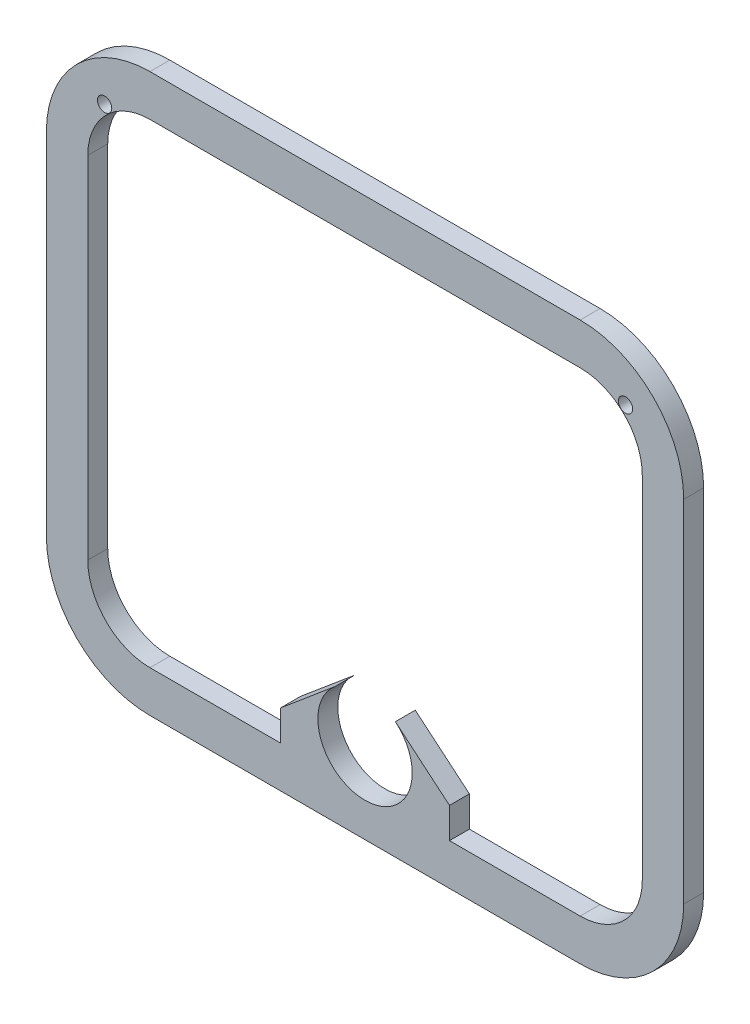
ISO-10303-21;
HEADER;
FILE_DESCRIPTION(('STEP AP214'),'2;1');
FILE_NAME('part.step','',(''),(''),'','','');
FILE_SCHEMA(('AUTOMOTIVE_DESIGN { 1 0 10303 214 1 1 1 1 }'));
ENDSEC;
DATA;
#1=APPLICATION_CONTEXT('core data for automotive mechanical design processes');
#2=APPLICATION_PROTOCOL_DEFINITION('international standard','automotive_design',2000,#1);
#3=PRODUCT_CONTEXT('',#1,'mechanical');
#4=PRODUCT('Part','Part','',(#3));
#5=PRODUCT_RELATED_PRODUCT_CATEGORY('part','',(#4));
#6=PRODUCT_DEFINITION_FORMATION('','',#4);
#7=PRODUCT_DEFINITION_CONTEXT('part definition',#1,'design');
#8=PRODUCT_DEFINITION('design','',#6,#7);
#9=PRODUCT_DEFINITION_SHAPE('','',#8);
#10=(LENGTH_UNIT() NAMED_UNIT(*) SI_UNIT(.MILLI.,.METRE.));
#11=(NAMED_UNIT(*) PLANE_ANGLE_UNIT() SI_UNIT($,.RADIAN.));
#12=(NAMED_UNIT(*) SI_UNIT($,.STERADIAN.) SOLID_ANGLE_UNIT());
#13=UNCERTAINTY_MEASURE_WITH_UNIT(LENGTH_MEASURE(1.E-05),#10,'distance_accuracy_value','');
#14=(GEOMETRIC_REPRESENTATION_CONTEXT(3) GLOBAL_UNCERTAINTY_ASSIGNED_CONTEXT((#13)) GLOBAL_UNIT_ASSIGNED_CONTEXT((#10,
#11,#12)) REPRESENTATION_CONTEXT('',''));
#15=CARTESIAN_POINT('',(0.,0.,0.));
#16=DIRECTION('',(0.,0.,1.));
#17=DIRECTION('',(1.,0.,0.));
#18=AXIS2_PLACEMENT_3D('',#15,#16,#17);
#19=CARTESIAN_POINT('',(-17.145,13.97,1.5875));
#20=DIRECTION('',(0.,0.,1.));
#21=DIRECTION('',(1.,0.,0.));
#22=AXIS2_PLACEMENT_3D('',#19,#20,#21);
#23=PLANE('',#22);
#24=DIRECTION('',(1.,0.,0.));
#25=VECTOR('',#24,1.);
#26=CARTESIAN_POINT('',(9.63209466642005,-18.923,1.5875));
#27=LINE('',#26,#25);
#28=CARTESIAN_POINT('',(6.73100000000013,-18.923,1.5875));
#29=VERTEX_POINT('',#28);
#30=CARTESIAN_POINT('',(17.145,-18.923,1.5875));
#31=VERTEX_POINT('',#30);
#32=EDGE_CURVE('E295',#29,#31,#27,.T.);
#33=ORIENTED_EDGE('',*,*,#32,.F.);
#34=DIRECTION('',(0.,-1.,0.));
#35=VECTOR('',#34,1.);
#36=CARTESIAN_POINT('',(6.73100000000013,-18.923,1.5875));
#37=LINE('',#36,#35);
#38=CARTESIAN_POINT('',(6.73100000000011,-16.4886925353965,1.5875));
#39=VERTEX_POINT('',#38);
#40=EDGE_CURVE('E317',#39,#29,#37,.T.);
#41=ORIENTED_EDGE('',*,*,#40,.F.);
#42=DIRECTION('',(0.766044443118977,-0.642787609686541,0.));
#43=VECTOR('',#42,1.);
#44=CARTESIAN_POINT('',(2.41636718233356,-12.8682857294272,1.5875));
#45=LINE('',#44,#43);
#46=CARTESIAN_POINT('',(2.41636718233356,-12.8682857294272,1.5875));
#47=VERTEX_POINT('',#46);
#48=EDGE_CURVE('E298',#47,#39,#45,.T.);
#49=ORIENTED_EDGE('',*,*,#48,.F.);
#50=CARTESIAN_POINT('',(0.,-15.748,1.5875));
#51=DIRECTION('',(0.,0.,1.));
#52=DIRECTION('',(1.,0.,0.));
#53=AXIS2_PLACEMENT_3D('',#50,#51,#52);
#54=CIRCLE('',#53,3.75919999999987);
#55=CARTESIAN_POINT('',(-2.41636718233356,-12.8682857294272,1.5875));
#56=VERTEX_POINT('',#55);
#57=EDGE_CURVE('E235',#56,#47,#54,.T.);
#58=ORIENTED_EDGE('',*,*,#57,.F.);
#59=DIRECTION('',(0.766044443118977,0.642787609686541,0.));
#60=VECTOR('',#59,1.);
#61=CARTESIAN_POINT('',(-2.41636718233356,-12.8682857294272,1.5875));
#62=LINE('',#61,#60);
#63=CARTESIAN_POINT('',(-6.731,-16.4886925353965,1.5875));
#64=VERTEX_POINT('',#63);
#65=EDGE_CURVE('E233',#64,#56,#62,.T.);
#66=ORIENTED_EDGE('',*,*,#65,.F.);
#67=DIRECTION('',(0.,1.,0.));
#68=VECTOR('',#67,1.);
#69=CARTESIAN_POINT('',(-6.731,-18.923,1.5875));
#70=LINE('',#69,#68);
#71=CARTESIAN_POINT('',(-6.731,-18.923,1.5875));
#72=VERTEX_POINT('',#71);
#73=EDGE_CURVE('E305',#72,#64,#70,.T.);
#74=ORIENTED_EDGE('',*,*,#73,.F.);
#75=DIRECTION('',(1.,0.,0.));
#76=VECTOR('',#75,1.);
#77=CARTESIAN_POINT('',(-17.145,-18.923,1.5875));
#78=LINE('',#77,#76);
#79=CARTESIAN_POINT('',(-17.145,-18.923,1.5875));
#80=VERTEX_POINT('',#79);
#81=EDGE_CURVE('E271',#80,#72,#78,.T.);
#82=ORIENTED_EDGE('',*,*,#81,.F.);
#83=CARTESIAN_POINT('',(-17.145,-13.97,1.5875));
#84=DIRECTION('',(0.,0.,1.));
#85=DIRECTION('',(-1.,0.,0.));
#86=AXIS2_PLACEMENT_3D('',#83,#84,#85);
#87=CIRCLE('',#86,4.953);
#88=CARTESIAN_POINT('',(-22.098,-13.97,1.5875));
#89=VERTEX_POINT('',#88);
#90=EDGE_CURVE('E274',#89,#80,#87,.T.);
#91=ORIENTED_EDGE('',*,*,#90,.F.);
#92=DIRECTION('',(0.,-1.,0.));
#93=VECTOR('',#92,1.);
#94=CARTESIAN_POINT('',(-22.098,13.97,1.5875));
#95=LINE('',#94,#93);
#96=CARTESIAN_POINT('',(-22.098,13.97,1.5875));
#97=VERTEX_POINT('',#96);
#98=EDGE_CURVE('E277',#97,#89,#95,.T.);
#99=ORIENTED_EDGE('',*,*,#98,.F.);
#100=CARTESIAN_POINT('',(-17.145,13.97,1.5875));
#101=DIRECTION('',(0.,0.,1.));
#102=DIRECTION('',(1.,0.,0.));
#103=AXIS2_PLACEMENT_3D('',#100,#101,#102);
#104=CIRCLE('',#103,4.953);
#105=CARTESIAN_POINT('',(-17.145,18.923,1.5875));
#106=VERTEX_POINT('',#105);
#107=EDGE_CURVE('E280',#106,#97,#104,.T.);
#108=ORIENTED_EDGE('',*,*,#107,.F.);
#109=DIRECTION('',(-1.,0.,0.));
#110=VECTOR('',#109,1.);
#111=CARTESIAN_POINT('',(17.145,18.923,1.5875));
#112=LINE('',#111,#110);
#113=CARTESIAN_POINT('',(17.145,18.923,1.5875));
#114=VERTEX_POINT('',#113);
#115=EDGE_CURVE('E283',#114,#106,#112,.T.);
#116=ORIENTED_EDGE('',*,*,#115,.F.);
#117=CARTESIAN_POINT('',(17.145,13.97,1.5875));
#118=DIRECTION('',(0.,0.,1.));
#119=DIRECTION('',(-1.,0.,0.));
#120=AXIS2_PLACEMENT_3D('',#117,#118,#119);
#121=CIRCLE('',#120,4.953);
#122=CARTESIAN_POINT('',(22.098,13.97,1.5875));
#123=VERTEX_POINT('',#122);
#124=EDGE_CURVE('E286',#123,#114,#121,.T.);
#125=ORIENTED_EDGE('',*,*,#124,.F.);
#126=DIRECTION('',(0.,1.,0.));
#127=VECTOR('',#126,1.);
#128=CARTESIAN_POINT('',(22.098,13.97,1.5875));
#129=LINE('',#128,#127);
#130=CARTESIAN_POINT('',(22.098,-13.97,1.5875));
#131=VERTEX_POINT('',#130);
#132=EDGE_CURVE('E289',#131,#123,#129,.T.);
#133=ORIENTED_EDGE('',*,*,#132,.F.);
#134=CARTESIAN_POINT('',(17.145,-13.97,1.5875));
#135=DIRECTION('',(0.,0.,1.));
#136=DIRECTION('',(-1.,0.,0.));
#137=AXIS2_PLACEMENT_3D('',#134,#135,#136);
#138=CIRCLE('',#137,4.953);
#139=EDGE_CURVE('E292',#31,#131,#138,.T.);
#140=ORIENTED_EDGE('',*,*,#139,.F.);
#141=EDGE_LOOP('',(#33,#41,#49,#58,#66,#74,#82,#91,#99,#108,#116,#125,#133,#140));
#142=FACE_BOUND('',#141,.T.);
#143=CARTESIAN_POINT('',(20.7596111227927,18.1646597324437,1.5875));
#144=DIRECTION('',(0.,0.,1.));
#145=DIRECTION('',(-1.,0.,0.));
#146=AXIS2_PLACEMENT_3D('',#143,#144,#145);
#147=CIRCLE('',#146,0.571499999999998);
#148=CARTESIAN_POINT('',(20.1881111227927,18.1646597324437,1.5875));
#149=VERTEX_POINT('',#148);
#150=EDGE_CURVE('E195',#149,#149,#147,.T.);
#151=ORIENTED_EDGE('',*,*,#150,.F.);
#152=EDGE_LOOP('',(#151));
#153=FACE_BOUND('',#152,.T.);
#154=CARTESIAN_POINT('',(-17.145,13.97,1.5875));
#155=DIRECTION('',(0.,0.,1.));
#156=DIRECTION('',(1.,0.,0.));
#157=AXIS2_PLACEMENT_3D('',#154,#155,#156);
#158=CIRCLE('',#157,8.255);
#159=CARTESIAN_POINT('',(-17.145,22.225,1.5875));
#160=VERTEX_POINT('',#159);
#161=CARTESIAN_POINT('',(-25.4,13.97,1.5875));
#162=VERTEX_POINT('',#161);
#163=EDGE_CURVE('E158',#160,#162,#158,.T.);
#164=ORIENTED_EDGE('',*,*,#163,.T.);
#165=DIRECTION('',(0.,-1.,0.));
#166=VECTOR('',#165,1.);
#167=CARTESIAN_POINT('',(-25.4,13.97,1.5875));
#168=LINE('',#167,#166);
#169=CARTESIAN_POINT('',(-25.4,-13.97,1.5875));
#170=VERTEX_POINT('',#169);
#171=EDGE_CURVE('E98',#162,#170,#168,.T.);
#172=ORIENTED_EDGE('',*,*,#171,.T.);
#173=CARTESIAN_POINT('',(-17.145,-13.97,1.5875));
#174=DIRECTION('',(0.,0.,1.));
#175=DIRECTION('',(-1.,0.,0.));
#176=AXIS2_PLACEMENT_3D('',#173,#174,#175);
#177=CIRCLE('',#176,8.255);
#178=CARTESIAN_POINT('',(-17.145,-22.225,1.5875));
#179=VERTEX_POINT('',#178);
#180=EDGE_CURVE('E173',#170,#179,#177,.T.);
#181=ORIENTED_EDGE('',*,*,#180,.T.);
#182=DIRECTION('',(1.,0.,0.));
#183=VECTOR('',#182,1.);
#184=CARTESIAN_POINT('',(17.145,-22.225,1.5875));
#185=LINE('',#184,#183);
#186=CARTESIAN_POINT('',(17.145,-22.225,1.5875));
#187=VERTEX_POINT('',#186);
#188=EDGE_CURVE('E186',#179,#187,#185,.T.);
#189=ORIENTED_EDGE('',*,*,#188,.T.);
#190=CARTESIAN_POINT('',(17.145,-13.97,1.5875));
#191=DIRECTION('',(0.,0.,1.));
#192=DIRECTION('',(-1.,0.,0.));
#193=AXIS2_PLACEMENT_3D('',#190,#191,#192);
#194=CIRCLE('',#193,8.255);
#195=CARTESIAN_POINT('',(25.4,-13.97,1.5875));
#196=VERTEX_POINT('',#195);
#197=EDGE_CURVE('E121',#187,#196,#194,.T.);
#198=ORIENTED_EDGE('',*,*,#197,.T.);
#199=DIRECTION('',(0.,1.,0.));
#200=VECTOR('',#199,1.);
#201=CARTESIAN_POINT('',(25.4,13.97,1.5875));
#202=LINE('',#201,#200);
#203=CARTESIAN_POINT('',(25.4,13.97,1.5875));
#204=VERTEX_POINT('',#203);
#205=EDGE_CURVE('E114',#196,#204,#202,.T.);
#206=ORIENTED_EDGE('',*,*,#205,.T.);
#207=CARTESIAN_POINT('',(17.145,13.97,1.5875));
#208=DIRECTION('',(0.,0.,1.));
#209=DIRECTION('',(-1.,0.,0.));
#210=AXIS2_PLACEMENT_3D('',#207,#208,#209);
#211=CIRCLE('',#210,8.255);
#212=CARTESIAN_POINT('',(17.145,22.225,1.5875));
#213=VERTEX_POINT('',#212);
#214=EDGE_CURVE('E118',#204,#213,#211,.T.);
#215=ORIENTED_EDGE('',*,*,#214,.T.);
#216=DIRECTION('',(-1.,0.,0.));
#217=VECTOR('',#216,1.);
#218=CARTESIAN_POINT('',(17.145,22.225,1.5875));
#219=LINE('',#218,#217);
#220=EDGE_CURVE('E57',#213,#160,#219,.T.);
#221=ORIENTED_EDGE('',*,*,#220,.T.);
#222=EDGE_LOOP('',(#164,#172,#181,#189,#198,#206,#215,#221));
#223=FACE_BOUND('',#222,.T.);
#224=CARTESIAN_POINT('',(-20.7596111227927,18.1646597324436,1.5875));
#225=DIRECTION('',(0.,0.,1.));
#226=DIRECTION('',(1.,0.,0.));
#227=AXIS2_PLACEMENT_3D('',#224,#225,#226);
#228=CIRCLE('',#227,0.571499999999999);
#229=CARTESIAN_POINT('',(-20.1881111227927,18.1646597324436,1.5875));
#230=VERTEX_POINT('',#229);
#231=EDGE_CURVE('E146',#230,#230,#228,.T.);
#232=ORIENTED_EDGE('',*,*,#231,.F.);
#233=EDGE_LOOP('',(#232));
#234=FACE_BOUND('',#233,.T.);
#235=ADVANCED_FACE('F33',(#142,#153,#223,#234),#23,.T.);
#236=CARTESIAN_POINT('',(-17.145,13.97,0.));
#237=DIRECTION('',(0.,0.,1.));
#238=DIRECTION('',(1.,0.,0.));
#239=AXIS2_PLACEMENT_3D('',#236,#237,#238);
#240=PLANE('',#239);
#241=CARTESIAN_POINT('',(20.7596111227927,18.1646597324437,0.));
#242=DIRECTION('',(0.,0.,1.));
#243=DIRECTION('',(-1.,0.,0.));
#244=AXIS2_PLACEMENT_3D('',#241,#242,#243);
#245=CIRCLE('',#244,0.571499999999998);
#246=CARTESIAN_POINT('',(20.1881111227927,18.1646597324437,0.));
#247=VERTEX_POINT('',#246);
#248=EDGE_CURVE('E198',#247,#247,#245,.T.);
#249=ORIENTED_EDGE('',*,*,#248,.T.);
#250=EDGE_LOOP('',(#249));
#251=FACE_BOUND('',#250,.T.);
#252=CARTESIAN_POINT('',(-17.145,13.97,0.));
#253=DIRECTION('',(0.,0.,1.));
#254=DIRECTION('',(1.,0.,0.));
#255=AXIS2_PLACEMENT_3D('',#252,#253,#254);
#256=CIRCLE('',#255,8.255);
#257=CARTESIAN_POINT('',(-17.145,22.225,0.));
#258=VERTEX_POINT('',#257);
#259=CARTESIAN_POINT('',(-25.4,13.97,0.));
#260=VERTEX_POINT('',#259);
#261=EDGE_CURVE('E142',#258,#260,#256,.T.);
#262=ORIENTED_EDGE('',*,*,#261,.F.);
#263=DIRECTION('',(-1.,0.,0.));
#264=VECTOR('',#263,1.);
#265=CARTESIAN_POINT('',(17.145,22.225,0.));
#266=LINE('',#265,#264);
#267=CARTESIAN_POINT('',(17.145,22.225,0.));
#268=VERTEX_POINT('',#267);
#269=EDGE_CURVE('E90',#268,#258,#266,.T.);
#270=ORIENTED_EDGE('',*,*,#269,.F.);
#271=CARTESIAN_POINT('',(17.145,13.97,0.));
#272=DIRECTION('',(0.,0.,1.));
#273=DIRECTION('',(-1.,0.,0.));
#274=AXIS2_PLACEMENT_3D('',#271,#272,#273);
#275=CIRCLE('',#274,8.255);
#276=CARTESIAN_POINT('',(25.4,13.97,0.));
#277=VERTEX_POINT('',#276);
#278=EDGE_CURVE('E155',#277,#268,#275,.T.);
#279=ORIENTED_EDGE('',*,*,#278,.F.);
#280=DIRECTION('',(0.,1.,0.));
#281=VECTOR('',#280,1.);
#282=CARTESIAN_POINT('',(25.4,13.97,0.));
#283=LINE('',#282,#281);
#284=CARTESIAN_POINT('',(25.4,-13.97,0.));
#285=VERTEX_POINT('',#284);
#286=EDGE_CURVE('E130',#285,#277,#283,.T.);
#287=ORIENTED_EDGE('',*,*,#286,.F.);
#288=CARTESIAN_POINT('',(17.145,-13.97,0.));
#289=DIRECTION('',(0.,0.,1.));
#290=DIRECTION('',(-1.,0.,0.));
#291=AXIS2_PLACEMENT_3D('',#288,#289,#290);
#292=CIRCLE('',#291,8.255);
#293=CARTESIAN_POINT('',(17.145,-22.225,0.));
#294=VERTEX_POINT('',#293);
#295=EDGE_CURVE('E152',#294,#285,#292,.T.);
#296=ORIENTED_EDGE('',*,*,#295,.F.);
#297=DIRECTION('',(1.,0.,0.));
#298=VECTOR('',#297,1.);
#299=CARTESIAN_POINT('',(17.145,-22.225,0.));
#300=LINE('',#299,#298);
#301=CARTESIAN_POINT('',(-17.145,-22.225,0.));
#302=VERTEX_POINT('',#301);
#303=EDGE_CURVE('E150',#302,#294,#300,.T.);
#304=ORIENTED_EDGE('',*,*,#303,.F.);
#305=CARTESIAN_POINT('',(-17.145,-13.97,0.));
#306=DIRECTION('',(0.,0.,1.));
#307=DIRECTION('',(-1.,0.,0.));
#308=AXIS2_PLACEMENT_3D('',#305,#306,#307);
#309=CIRCLE('',#308,8.255);
#310=CARTESIAN_POINT('',(-25.4,-13.97,0.));
#311=VERTEX_POINT('',#310);
#312=EDGE_CURVE('E148',#311,#302,#309,.T.);
#313=ORIENTED_EDGE('',*,*,#312,.F.);
#314=DIRECTION('',(0.,-1.,0.));
#315=VECTOR('',#314,1.);
#316=CARTESIAN_POINT('',(-25.4,13.97,0.));
#317=LINE('',#316,#315);
#318=EDGE_CURVE('E145',#260,#311,#317,.T.);
#319=ORIENTED_EDGE('',*,*,#318,.F.);
#320=EDGE_LOOP('',(#262,#270,#279,#287,#296,#304,#313,#319));
#321=FACE_BOUND('',#320,.T.);
#322=CARTESIAN_POINT('',(-20.7596111227927,18.1646597324436,0.));
#323=DIRECTION('',(0.,0.,1.));
#324=DIRECTION('',(1.,0.,0.));
#325=AXIS2_PLACEMENT_3D('',#322,#323,#324);
#326=CIRCLE('',#325,0.571499999999999);
#327=CARTESIAN_POINT('',(-20.1881111227927,18.1646597324436,0.));
#328=VERTEX_POINT('',#327);
#329=EDGE_CURVE('E192',#328,#328,#326,.T.);
#330=ORIENTED_EDGE('',*,*,#329,.T.);
#331=EDGE_LOOP('',(#330));
#332=FACE_BOUND('',#331,.T.);
#333=DIRECTION('',(0.,1.,0.));
#334=VECTOR('',#333,1.);
#335=CARTESIAN_POINT('',(6.73100000000013,-18.923,0.));
#336=LINE('',#335,#334);
#337=CARTESIAN_POINT('',(6.73100000000013,-18.923,0.));
#338=VERTEX_POINT('',#337);
#339=CARTESIAN_POINT('',(6.73100000000011,-16.4886925353965,0.));
#340=VERTEX_POINT('',#339);
#341=EDGE_CURVE('E320',#338,#340,#336,.T.);
#342=ORIENTED_EDGE('',*,*,#341,.F.);
#343=DIRECTION('',(1.,0.,0.));
#344=VECTOR('',#343,1.);
#345=CARTESIAN_POINT('',(9.63209466642005,-18.923,0.));
#346=LINE('',#345,#344);
#347=CARTESIAN_POINT('',(17.145,-18.923,0.));
#348=VERTEX_POINT('',#347);
#349=EDGE_CURVE('E260',#338,#348,#346,.T.);
#350=ORIENTED_EDGE('',*,*,#349,.T.);
#351=CARTESIAN_POINT('',(17.145,-13.97,0.));
#352=DIRECTION('',(0.,0.,1.));
#353=DIRECTION('',(-1.,0.,0.));
#354=AXIS2_PLACEMENT_3D('',#351,#352,#353);
#355=CIRCLE('',#354,4.953);
#356=CARTESIAN_POINT('',(22.098,-13.97,0.));
#357=VERTEX_POINT('',#356);
#358=EDGE_CURVE('E257',#348,#357,#355,.T.);
#359=ORIENTED_EDGE('',*,*,#358,.T.);
#360=DIRECTION('',(0.,1.,0.));
#361=VECTOR('',#360,1.);
#362=CARTESIAN_POINT('',(22.098,13.97,0.));
#363=LINE('',#362,#361);
#364=CARTESIAN_POINT('',(22.098,13.97,0.));
#365=VERTEX_POINT('',#364);
#366=EDGE_CURVE('E254',#357,#365,#363,.T.);
#367=ORIENTED_EDGE('',*,*,#366,.T.);
#368=CARTESIAN_POINT('',(17.145,13.97,0.));
#369=DIRECTION('',(0.,0.,1.));
#370=DIRECTION('',(-1.,0.,0.));
#371=AXIS2_PLACEMENT_3D('',#368,#369,#370);
#372=CIRCLE('',#371,4.953);
#373=CARTESIAN_POINT('',(17.145,18.923,0.));
#374=VERTEX_POINT('',#373);
#375=EDGE_CURVE('E251',#365,#374,#372,.T.);
#376=ORIENTED_EDGE('',*,*,#375,.T.);
#377=DIRECTION('',(-1.,0.,0.));
#378=VECTOR('',#377,1.);
#379=CARTESIAN_POINT('',(17.145,18.923,0.));
#380=LINE('',#379,#378);
#381=CARTESIAN_POINT('',(-17.145,18.923,0.));
#382=VERTEX_POINT('',#381);
#383=EDGE_CURVE('E248',#374,#382,#380,.T.);
#384=ORIENTED_EDGE('',*,*,#383,.T.);
#385=CARTESIAN_POINT('',(-17.145,13.97,0.));
#386=DIRECTION('',(0.,0.,1.));
#387=DIRECTION('',(1.,0.,0.));
#388=AXIS2_PLACEMENT_3D('',#385,#386,#387);
#389=CIRCLE('',#388,4.953);
#390=CARTESIAN_POINT('',(-22.098,13.97,0.));
#391=VERTEX_POINT('',#390);
#392=EDGE_CURVE('E245',#382,#391,#389,.T.);
#393=ORIENTED_EDGE('',*,*,#392,.T.);
#394=DIRECTION('',(0.,-1.,0.));
#395=VECTOR('',#394,1.);
#396=CARTESIAN_POINT('',(-22.098,13.97,0.));
#397=LINE('',#396,#395);
#398=CARTESIAN_POINT('',(-22.098,-13.97,0.));
#399=VERTEX_POINT('',#398);
#400=EDGE_CURVE('E242',#391,#399,#397,.T.);
#401=ORIENTED_EDGE('',*,*,#400,.T.);
#402=CARTESIAN_POINT('',(-17.145,-13.97,0.));
#403=DIRECTION('',(0.,0.,1.));
#404=DIRECTION('',(-1.,0.,0.));
#405=AXIS2_PLACEMENT_3D('',#402,#403,#404);
#406=CIRCLE('',#405,4.953);
#407=CARTESIAN_POINT('',(-17.145,-18.923,0.));
#408=VERTEX_POINT('',#407);
#409=EDGE_CURVE('E239',#399,#408,#406,.T.);
#410=ORIENTED_EDGE('',*,*,#409,.T.);
#411=DIRECTION('',(1.,0.,0.));
#412=VECTOR('',#411,1.);
#413=CARTESIAN_POINT('',(-17.145,-18.923,0.));
#414=LINE('',#413,#412);
#415=CARTESIAN_POINT('',(-6.731,-18.923,0.));
#416=VERTEX_POINT('',#415);
#417=EDGE_CURVE('E236',#408,#416,#414,.T.);
#418=ORIENTED_EDGE('',*,*,#417,.T.);
#419=DIRECTION('',(0.,-1.,0.));
#420=VECTOR('',#419,1.);
#421=CARTESIAN_POINT('',(-6.731,-18.923,0.));
#422=LINE('',#421,#420);
#423=CARTESIAN_POINT('',(-6.731,-16.4886925353965,0.));
#424=VERTEX_POINT('',#423);
#425=EDGE_CURVE('E308',#424,#416,#422,.T.);
#426=ORIENTED_EDGE('',*,*,#425,.F.);
#427=DIRECTION('',(0.766044443118977,0.642787609686541,0.));
#428=VECTOR('',#427,1.);
#429=CARTESIAN_POINT('',(-2.41636718233356,-12.8682857294272,0.));
#430=LINE('',#429,#428);
#431=CARTESIAN_POINT('',(-2.41636718233356,-12.8682857294272,0.));
#432=VERTEX_POINT('',#431);
#433=EDGE_CURVE('E48',#424,#432,#430,.T.);
#434=ORIENTED_EDGE('',*,*,#433,.T.);
#435=CARTESIAN_POINT('',(0.,-15.748,0.));
#436=DIRECTION('',(0.,0.,1.));
#437=DIRECTION('',(1.,0.,0.));
#438=AXIS2_PLACEMENT_3D('',#435,#436,#437);
#439=CIRCLE('',#438,3.75919999999987);
#440=CARTESIAN_POINT('',(2.41636718233356,-12.8682857294272,0.));
#441=VERTEX_POINT('',#440);
#442=EDGE_CURVE('E266',#432,#441,#439,.T.);
#443=ORIENTED_EDGE('',*,*,#442,.T.);
#444=DIRECTION('',(0.766044443118977,-0.642787609686541,0.));
#445=VECTOR('',#444,1.);
#446=CARTESIAN_POINT('',(2.41636718233356,-12.8682857294272,0.));
#447=LINE('',#446,#445);
#448=EDGE_CURVE('E263',#441,#340,#447,.T.);
#449=ORIENTED_EDGE('',*,*,#448,.T.);
#450=EDGE_LOOP('',(#342,#350,#359,#367,#376,#384,#393,#401,#410,#418,#426,#434,#443,#449));
#451=FACE_BOUND('',#450,.T.);
#452=ADVANCED_FACE('F177',(#251,#321,#332,#451),#240,.F.);
#453=CARTESIAN_POINT('',(-17.145,13.97,1.5875));
#454=DIRECTION('',(0.,0.,-1.));
#455=DIRECTION('',(-1.,0.,0.));
#456=AXIS2_PLACEMENT_3D('',#453,#454,#455);
#457=CYLINDRICAL_SURFACE('',#456,8.255);
#458=ORIENTED_EDGE('',*,*,#261,.T.);
#459=DIRECTION('',(0.,0.,-1.));
#460=VECTOR('',#459,1.);
#461=CARTESIAN_POINT('',(-25.4,13.97,1.5875));
#462=LINE('',#461,#460);
#463=EDGE_CURVE('E11',#162,#260,#462,.T.);
#464=ORIENTED_EDGE('',*,*,#463,.F.);
#465=ORIENTED_EDGE('',*,*,#163,.F.);
#466=DIRECTION('',(0.,0.,-1.));
#467=VECTOR('',#466,1.);
#468=CARTESIAN_POINT('',(-17.145,22.225,1.5875));
#469=LINE('',#468,#467);
#470=EDGE_CURVE('E138',#160,#258,#469,.T.);
#471=ORIENTED_EDGE('',*,*,#470,.T.);
#472=EDGE_LOOP('',(#458,#464,#465,#471));
#473=FACE_BOUND('',#472,.T.);
#474=ADVANCED_FACE('F35',(#473),#457,.T.);
#475=CARTESIAN_POINT('',(-25.4,13.97,1.5875));
#476=DIRECTION('',(1.,0.,0.));
#477=DIRECTION('',(0.,0.,-1.));
#478=AXIS2_PLACEMENT_3D('',#475,#476,#477);
#479=PLANE('',#478);
#480=ORIENTED_EDGE('',*,*,#318,.T.);
#481=DIRECTION('',(0.,0.,-1.));
#482=VECTOR('',#481,1.);
#483=CARTESIAN_POINT('',(-25.4,-13.97,1.5875));
#484=LINE('',#483,#482);
#485=EDGE_CURVE('E41',#170,#311,#484,.T.);
#486=ORIENTED_EDGE('',*,*,#485,.F.);
#487=ORIENTED_EDGE('',*,*,#171,.F.);
#488=ORIENTED_EDGE('',*,*,#463,.T.);
#489=EDGE_LOOP('',(#480,#486,#487,#488));
#490=FACE_BOUND('',#489,.T.);
#491=ADVANCED_FACE('F449',(#490),#479,.F.);
#492=CARTESIAN_POINT('',(-17.145,-13.97,1.5875));
#493=DIRECTION('',(0.,0.,-1.));
#494=DIRECTION('',(-1.,0.,0.));
#495=AXIS2_PLACEMENT_3D('',#492,#493,#494);
#496=CYLINDRICAL_SURFACE('',#495,8.255);
#497=ORIENTED_EDGE('',*,*,#312,.T.);
#498=DIRECTION('',(0.,0.,-1.));
#499=VECTOR('',#498,1.);
#500=CARTESIAN_POINT('',(-17.145,-22.225,1.5875));
#501=LINE('',#500,#499);
#502=EDGE_CURVE('E165',#179,#302,#501,.T.);
#503=ORIENTED_EDGE('',*,*,#502,.F.);
#504=ORIENTED_EDGE('',*,*,#180,.F.);
#505=ORIENTED_EDGE('',*,*,#485,.T.);
#506=EDGE_LOOP('',(#497,#503,#504,#505));
#507=FACE_BOUND('',#506,.T.);
#508=ADVANCED_FACE('F171',(#507),#496,.T.);
#509=CARTESIAN_POINT('',(17.145,-22.225,1.5875));
#510=DIRECTION('',(0.,1.,0.));
#511=DIRECTION('',(0.,0.,1.));
#512=AXIS2_PLACEMENT_3D('',#509,#510,#511);
#513=PLANE('',#512);
#514=ORIENTED_EDGE('',*,*,#303,.T.);
#515=DIRECTION('',(0.,0.,-1.));
#516=VECTOR('',#515,1.);
#517=CARTESIAN_POINT('',(17.145,-22.225,1.5875));
#518=LINE('',#517,#516);
#519=EDGE_CURVE('E162',#187,#294,#518,.T.);
#520=ORIENTED_EDGE('',*,*,#519,.F.);
#521=ORIENTED_EDGE('',*,*,#188,.F.);
#522=ORIENTED_EDGE('',*,*,#502,.T.);
#523=EDGE_LOOP('',(#514,#520,#521,#522));
#524=FACE_BOUND('',#523,.T.);
#525=ADVANCED_FACE('F182',(#524),#513,.F.);
#526=CARTESIAN_POINT('',(17.145,-13.97,1.5875));
#527=DIRECTION('',(0.,0.,-1.));
#528=DIRECTION('',(-1.,0.,0.));
#529=AXIS2_PLACEMENT_3D('',#526,#527,#528);
#530=CYLINDRICAL_SURFACE('',#529,8.255);
#531=ORIENTED_EDGE('',*,*,#295,.T.);
#532=DIRECTION('',(0.,0.,-1.));
#533=VECTOR('',#532,1.);
#534=CARTESIAN_POINT('',(25.4,-13.97,1.5875));
#535=LINE('',#534,#533);
#536=EDGE_CURVE('E133',#196,#285,#535,.T.);
#537=ORIENTED_EDGE('',*,*,#536,.F.);
#538=ORIENTED_EDGE('',*,*,#197,.F.);
#539=ORIENTED_EDGE('',*,*,#519,.T.);
#540=EDGE_LOOP('',(#531,#537,#538,#539));
#541=FACE_BOUND('',#540,.T.);
#542=ADVANCED_FACE('F185',(#541),#530,.T.);
#543=CARTESIAN_POINT('',(25.4,13.97,1.5875));
#544=DIRECTION('',(-1.,0.,0.));
#545=DIRECTION('',(0.,-1.,0.));
#546=AXIS2_PLACEMENT_3D('',#543,#544,#545);
#547=PLANE('',#546);
#548=ORIENTED_EDGE('',*,*,#286,.T.);
#549=DIRECTION('',(0.,0.,-1.));
#550=VECTOR('',#549,1.);
#551=CARTESIAN_POINT('',(25.4,13.97,1.5875));
#552=LINE('',#551,#550);
#553=EDGE_CURVE('E127',#204,#277,#552,.T.);
#554=ORIENTED_EDGE('',*,*,#553,.F.);
#555=ORIENTED_EDGE('',*,*,#205,.F.);
#556=ORIENTED_EDGE('',*,*,#536,.T.);
#557=EDGE_LOOP('',(#548,#554,#555,#556));
#558=FACE_BOUND('',#557,.T.);
#559=ADVANCED_FACE('F128',(#558),#547,.F.);
#560=CARTESIAN_POINT('',(17.145,13.97,1.5875));
#561=DIRECTION('',(0.,0.,-1.));
#562=DIRECTION('',(-1.,0.,0.));
#563=AXIS2_PLACEMENT_3D('',#560,#561,#562);
#564=CYLINDRICAL_SURFACE('',#563,8.255);
#565=ORIENTED_EDGE('',*,*,#278,.T.);
#566=DIRECTION('',(0.,0.,-1.));
#567=VECTOR('',#566,1.);
#568=CARTESIAN_POINT('',(17.145,22.225,1.5875));
#569=LINE('',#568,#567);
#570=EDGE_CURVE('E134',#213,#268,#569,.T.);
#571=ORIENTED_EDGE('',*,*,#570,.F.);
#572=ORIENTED_EDGE('',*,*,#214,.F.);
#573=ORIENTED_EDGE('',*,*,#553,.T.);
#574=EDGE_LOOP('',(#565,#571,#572,#573));
#575=FACE_BOUND('',#574,.T.);
#576=ADVANCED_FACE('F136',(#575),#564,.T.);
#577=CARTESIAN_POINT('',(17.145,22.225,1.5875));
#578=DIRECTION('',(0.,-1.,0.));
#579=DIRECTION('',(0.,0.,-1.));
#580=AXIS2_PLACEMENT_3D('',#577,#578,#579);
#581=PLANE('',#580);
#582=ORIENTED_EDGE('',*,*,#269,.T.);
#583=ORIENTED_EDGE('',*,*,#470,.F.);
#584=ORIENTED_EDGE('',*,*,#220,.F.);
#585=ORIENTED_EDGE('',*,*,#570,.T.);
#586=EDGE_LOOP('',(#582,#583,#584,#585));
#587=FACE_BOUND('',#586,.T.);
#588=ADVANCED_FACE('F437',(#587),#581,.F.);
#589=CARTESIAN_POINT('',(-20.7596111227927,18.1646597324436,1.5875));
#590=DIRECTION('',(0.,0.,-1.));
#591=DIRECTION('',(-1.,0.,0.));
#592=AXIS2_PLACEMENT_3D('',#589,#590,#591);
#593=CYLINDRICAL_SURFACE('',#592,0.571499999999999);
#594=ORIENTED_EDGE('',*,*,#231,.T.);
#595=EDGE_LOOP('',(#594));
#596=FACE_BOUND('',#595,.T.);
#597=ORIENTED_EDGE('',*,*,#329,.F.);
#598=EDGE_LOOP('',(#597));
#599=FACE_BOUND('',#598,.T.);
#600=ADVANCED_FACE('F434',(#596,#599),#593,.F.);
#601=CARTESIAN_POINT('',(20.7596111227927,18.1646597324437,1.5875));
#602=DIRECTION('',(0.,0.,-1.));
#603=DIRECTION('',(-1.,0.,0.));
#604=AXIS2_PLACEMENT_3D('',#601,#602,#603);
#605=CYLINDRICAL_SURFACE('',#604,0.571499999999998);
#606=ORIENTED_EDGE('',*,*,#150,.T.);
#607=EDGE_LOOP('',(#606));
#608=FACE_BOUND('',#607,.T.);
#609=ORIENTED_EDGE('',*,*,#248,.F.);
#610=EDGE_LOOP('',(#609));
#611=FACE_BOUND('',#610,.T.);
#612=ADVANCED_FACE('F581',(#608,#611),#605,.F.);
#613=CARTESIAN_POINT('',(0.,-15.748,1.5875));
#614=DIRECTION('',(0.,0.,-1.));
#615=DIRECTION('',(-1.,0.,0.));
#616=AXIS2_PLACEMENT_3D('',#613,#614,#615);
#617=CYLINDRICAL_SURFACE('',#616,3.75919999999987);
#618=ORIENTED_EDGE('',*,*,#442,.F.);
#619=DIRECTION('',(0.,0.,-1.));
#620=VECTOR('',#619,1.);
#621=CARTESIAN_POINT('',(-2.41636718233356,-12.8682857294272,1.5875));
#622=LINE('',#621,#620);
#623=EDGE_CURVE('E230',#56,#432,#622,.T.);
#624=ORIENTED_EDGE('',*,*,#623,.F.);
#625=ORIENTED_EDGE('',*,*,#57,.T.);
#626=DIRECTION('',(0.,0.,-1.));
#627=VECTOR('',#626,1.);
#628=CARTESIAN_POINT('',(2.41636718233356,-12.8682857294272,1.5875));
#629=LINE('',#628,#627);
#630=EDGE_CURVE('E201',#47,#441,#629,.T.);
#631=ORIENTED_EDGE('',*,*,#630,.T.);
#632=EDGE_LOOP('',(#618,#624,#625,#631));
#633=FACE_BOUND('',#632,.T.);
#634=ADVANCED_FACE('F345',(#633),#617,.F.);
#635=CARTESIAN_POINT('',(2.41636718233356,-12.8682857294272,1.5875));
#636=DIRECTION('',(0.642787609686541,0.766044443118977,0.));
#637=DIRECTION('',(-0.766044443118977,0.642787609686541,0.));
#638=AXIS2_PLACEMENT_3D('',#635,#636,#637);
#639=PLANE('',#638);
#640=DIRECTION('',(0.,0.,-1.));
#641=VECTOR('',#640,1.);
#642=CARTESIAN_POINT('',(6.731,-16.4886925353965,-0.000999999999999916));
#643=LINE('',#642,#641);
#644=EDGE_CURVE('E323',#39,#340,#643,.T.);
#645=ORIENTED_EDGE('',*,*,#644,.T.);
#646=ORIENTED_EDGE('',*,*,#448,.F.);
#647=ORIENTED_EDGE('',*,*,#630,.F.);
#648=ORIENTED_EDGE('',*,*,#48,.T.);
#649=EDGE_LOOP('',(#645,#646,#647,#648));
#650=FACE_BOUND('',#649,.T.);
#651=ADVANCED_FACE('F329',(#650),#639,.T.);
#652=CARTESIAN_POINT('',(9.63209466642005,-18.923,1.5875));
#653=DIRECTION('',(0.,1.,0.));
#654=DIRECTION('',(-1.,0.,0.));
#655=AXIS2_PLACEMENT_3D('',#652,#653,#654);
#656=PLANE('',#655);
#657=ORIENTED_EDGE('',*,*,#349,.F.);
#658=DIRECTION('',(0.,0.,1.));
#659=VECTOR('',#658,1.);
#660=CARTESIAN_POINT('',(6.73100000000013,-18.923,-0.000999999999999916));
#661=LINE('',#660,#659);
#662=EDGE_CURVE('E314',#338,#29,#661,.T.);
#663=ORIENTED_EDGE('',*,*,#662,.T.);
#664=ORIENTED_EDGE('',*,*,#32,.T.);
#665=DIRECTION('',(0.,0.,-1.));
#666=VECTOR('',#665,1.);
#667=CARTESIAN_POINT('',(17.145,-18.923,1.5875));
#668=LINE('',#667,#666);
#669=EDGE_CURVE('E206',#31,#348,#668,.T.);
#670=ORIENTED_EDGE('',*,*,#669,.T.);
#671=EDGE_LOOP('',(#657,#663,#664,#670));
#672=FACE_BOUND('',#671,.T.);
#673=ADVANCED_FACE('F475',(#672),#656,.T.);
#674=CARTESIAN_POINT('',(17.145,-13.97,1.5875));
#675=DIRECTION('',(0.,0.,-1.));
#676=DIRECTION('',(-1.,0.,0.));
#677=AXIS2_PLACEMENT_3D('',#674,#675,#676);
#678=CYLINDRICAL_SURFACE('',#677,4.953);
#679=ORIENTED_EDGE('',*,*,#358,.F.);
#680=ORIENTED_EDGE('',*,*,#669,.F.);
#681=ORIENTED_EDGE('',*,*,#139,.T.);
#682=DIRECTION('',(0.,0.,-1.));
#683=VECTOR('',#682,1.);
#684=CARTESIAN_POINT('',(22.098,-13.97,1.5875));
#685=LINE('',#684,#683);
#686=EDGE_CURVE('E209',#131,#357,#685,.T.);
#687=ORIENTED_EDGE('',*,*,#686,.T.);
#688=EDGE_LOOP('',(#679,#680,#681,#687));
#689=FACE_BOUND('',#688,.T.);
#690=ADVANCED_FACE('F487',(#689),#678,.F.);
#691=CARTESIAN_POINT('',(22.098,13.97,1.5875));
#692=DIRECTION('',(-1.,0.,0.));
#693=DIRECTION('',(0.,-1.,0.));
#694=AXIS2_PLACEMENT_3D('',#691,#692,#693);
#695=PLANE('',#694);
#696=ORIENTED_EDGE('',*,*,#366,.F.);
#697=ORIENTED_EDGE('',*,*,#686,.F.);
#698=ORIENTED_EDGE('',*,*,#132,.T.);
#699=DIRECTION('',(0.,0.,-1.));
#700=VECTOR('',#699,1.);
#701=CARTESIAN_POINT('',(22.098,13.97,1.5875));
#702=LINE('',#701,#700);
#703=EDGE_CURVE('E212',#123,#365,#702,.T.);
#704=ORIENTED_EDGE('',*,*,#703,.T.);
#705=EDGE_LOOP('',(#696,#697,#698,#704));
#706=FACE_BOUND('',#705,.T.);
#707=ADVANCED_FACE('F557',(#706),#695,.T.);
#708=CARTESIAN_POINT('',(17.145,13.97,1.5875));
#709=DIRECTION('',(0.,0.,-1.));
#710=DIRECTION('',(-1.,0.,0.));
#711=AXIS2_PLACEMENT_3D('',#708,#709,#710);
#712=CYLINDRICAL_SURFACE('',#711,4.953);
#713=ORIENTED_EDGE('',*,*,#375,.F.);
#714=ORIENTED_EDGE('',*,*,#703,.F.);
#715=ORIENTED_EDGE('',*,*,#124,.T.);
#716=DIRECTION('',(0.,0.,-1.));
#717=VECTOR('',#716,1.);
#718=CARTESIAN_POINT('',(17.145,18.923,1.5875));
#719=LINE('',#718,#717);
#720=EDGE_CURVE('E215',#114,#374,#719,.T.);
#721=ORIENTED_EDGE('',*,*,#720,.T.);
#722=EDGE_LOOP('',(#713,#714,#715,#721));
#723=FACE_BOUND('',#722,.T.);
#724=ADVANCED_FACE('F548',(#723),#712,.F.);
#725=CARTESIAN_POINT('',(17.145,18.923,1.5875));
#726=DIRECTION('',(0.,-1.,0.));
#727=DIRECTION('',(1.,0.,0.));
#728=AXIS2_PLACEMENT_3D('',#725,#726,#727);
#729=PLANE('',#728);
#730=ORIENTED_EDGE('',*,*,#383,.F.);
#731=ORIENTED_EDGE('',*,*,#720,.F.);
#732=ORIENTED_EDGE('',*,*,#115,.T.);
#733=DIRECTION('',(0.,0.,-1.));
#734=VECTOR('',#733,1.);
#735=CARTESIAN_POINT('',(-17.145,18.923,1.5875));
#736=LINE('',#735,#734);
#737=EDGE_CURVE('E218',#106,#382,#736,.T.);
#738=ORIENTED_EDGE('',*,*,#737,.T.);
#739=EDGE_LOOP('',(#730,#731,#732,#738));
#740=FACE_BOUND('',#739,.T.);
#741=ADVANCED_FACE('F540',(#740),#729,.T.);
#742=CARTESIAN_POINT('',(-17.145,13.97,1.5875));
#743=DIRECTION('',(0.,0.,-1.));
#744=DIRECTION('',(-1.,0.,0.));
#745=AXIS2_PLACEMENT_3D('',#742,#743,#744);
#746=CYLINDRICAL_SURFACE('',#745,4.953);
#747=ORIENTED_EDGE('',*,*,#392,.F.);
#748=ORIENTED_EDGE('',*,*,#737,.F.);
#749=ORIENTED_EDGE('',*,*,#107,.T.);
#750=DIRECTION('',(0.,0.,-1.));
#751=VECTOR('',#750,1.);
#752=CARTESIAN_POINT('',(-22.098,13.97,1.5875));
#753=LINE('',#752,#751);
#754=EDGE_CURVE('E221',#97,#391,#753,.T.);
#755=ORIENTED_EDGE('',*,*,#754,.T.);
#756=EDGE_LOOP('',(#747,#748,#749,#755));
#757=FACE_BOUND('',#756,.T.);
#758=ADVANCED_FACE('F532',(#757),#746,.F.);
#759=CARTESIAN_POINT('',(-22.098,13.97,1.5875));
#760=DIRECTION('',(1.,0.,0.));
#761=DIRECTION('',(0.,1.,0.));
#762=AXIS2_PLACEMENT_3D('',#759,#760,#761);
#763=PLANE('',#762);
#764=ORIENTED_EDGE('',*,*,#400,.F.);
#765=ORIENTED_EDGE('',*,*,#754,.F.);
#766=ORIENTED_EDGE('',*,*,#98,.T.);
#767=DIRECTION('',(0.,0.,-1.));
#768=VECTOR('',#767,1.);
#769=CARTESIAN_POINT('',(-22.098,-13.97,1.5875));
#770=LINE('',#769,#768);
#771=EDGE_CURVE('E224',#89,#399,#770,.T.);
#772=ORIENTED_EDGE('',*,*,#771,.T.);
#773=EDGE_LOOP('',(#764,#765,#766,#772));
#774=FACE_BOUND('',#773,.T.);
#775=ADVANCED_FACE('F411',(#774),#763,.T.);
#776=CARTESIAN_POINT('',(-17.145,-13.97,1.5875));
#777=DIRECTION('',(0.,0.,-1.));
#778=DIRECTION('',(-1.,0.,0.));
#779=AXIS2_PLACEMENT_3D('',#776,#777,#778);
#780=CYLINDRICAL_SURFACE('',#779,4.953);
#781=ORIENTED_EDGE('',*,*,#409,.F.);
#782=ORIENTED_EDGE('',*,*,#771,.F.);
#783=ORIENTED_EDGE('',*,*,#90,.T.);
#784=DIRECTION('',(0.,0.,-1.));
#785=VECTOR('',#784,1.);
#786=CARTESIAN_POINT('',(-17.145,-18.923,1.5875));
#787=LINE('',#786,#785);
#788=EDGE_CURVE('E227',#80,#408,#787,.T.);
#789=ORIENTED_EDGE('',*,*,#788,.T.);
#790=EDGE_LOOP('',(#781,#782,#783,#789));
#791=FACE_BOUND('',#790,.T.);
#792=ADVANCED_FACE('F404',(#791),#780,.F.);
#793=CARTESIAN_POINT('',(-17.145,-18.923,1.5875));
#794=DIRECTION('',(0.,1.,0.));
#795=DIRECTION('',(-1.,0.,0.));
#796=AXIS2_PLACEMENT_3D('',#793,#794,#795);
#797=PLANE('',#796);
#798=ORIENTED_EDGE('',*,*,#417,.F.);
#799=ORIENTED_EDGE('',*,*,#788,.F.);
#800=ORIENTED_EDGE('',*,*,#81,.T.);
#801=DIRECTION('',(0.,0.,1.));
#802=VECTOR('',#801,1.);
#803=CARTESIAN_POINT('',(-6.731,-18.923,-0.000999999999999916));
#804=LINE('',#803,#802);
#805=EDGE_CURVE('E268',#416,#72,#804,.T.);
#806=ORIENTED_EDGE('',*,*,#805,.F.);
#807=EDGE_LOOP('',(#798,#799,#800,#806));
#808=FACE_BOUND('',#807,.T.);
#809=ADVANCED_FACE('F408',(#808),#797,.T.);
#810=CARTESIAN_POINT('',(-2.41636718233356,-12.8682857294272,1.5875));
#811=DIRECTION('',(-0.642787609686541,0.766044443118977,0.));
#812=DIRECTION('',(-0.766044443118977,-0.642787609686541,0.));
#813=AXIS2_PLACEMENT_3D('',#810,#811,#812);
#814=PLANE('',#813);
#815=DIRECTION('',(0.,0.,1.));
#816=VECTOR('',#815,1.);
#817=CARTESIAN_POINT('',(-6.731,-16.4886925353965,-0.000999999999999916));
#818=LINE('',#817,#816);
#819=EDGE_CURVE('E311',#424,#64,#818,.T.);
#820=ORIENTED_EDGE('',*,*,#819,.T.);
#821=ORIENTED_EDGE('',*,*,#65,.T.);
#822=ORIENTED_EDGE('',*,*,#623,.T.);
#823=ORIENTED_EDGE('',*,*,#433,.F.);
#824=EDGE_LOOP('',(#820,#821,#822,#823));
#825=FACE_BOUND('',#824,.T.);
#826=ADVANCED_FACE('F348',(#825),#814,.T.);
#827=CARTESIAN_POINT('',(-6.731,-18.923,-0.000999999999999916));
#828=DIRECTION('',(1.,0.,0.));
#829=DIRECTION('',(0.,0.,-1.));
#830=AXIS2_PLACEMENT_3D('',#827,#828,#829);
#831=PLANE('',#830);
#832=ORIENTED_EDGE('',*,*,#425,.T.);
#833=ORIENTED_EDGE('',*,*,#805,.T.);
#834=ORIENTED_EDGE('',*,*,#73,.T.);
#835=ORIENTED_EDGE('',*,*,#819,.F.);
#836=EDGE_LOOP('',(#832,#833,#834,#835));
#837=FACE_BOUND('',#836,.T.);
#838=ADVANCED_FACE('F416',(#837),#831,.F.);
#839=CARTESIAN_POINT('',(6.73100000000013,-18.923,-0.000999999999999916));
#840=DIRECTION('',(-1.,0.,0.));
#841=DIRECTION('',(0.,-1.,0.));
#842=AXIS2_PLACEMENT_3D('',#839,#840,#841);
#843=PLANE('',#842);
#844=ORIENTED_EDGE('',*,*,#341,.T.);
#845=ORIENTED_EDGE('',*,*,#644,.F.);
#846=ORIENTED_EDGE('',*,*,#40,.T.);
#847=ORIENTED_EDGE('',*,*,#662,.F.);
#848=EDGE_LOOP('',(#844,#845,#846,#847));
#849=FACE_BOUND('',#848,.T.);
#850=ADVANCED_FACE('F418',(#849),#843,.F.);
#851=CLOSED_SHELL('',(#235,#452,#474,#491,#508,#525,#542,#559,#576,#588,#600,#612,#634,#651,
#673,#690,#707,#724,#741,#758,#775,#792,#809,#826,#838,#850));
#852=MANIFOLD_SOLID_BREP('B2',#851);
#853=ADVANCED_BREP_SHAPE_REPRESENTATION('',(#18,#852),#14);
#854=SHAPE_DEFINITION_REPRESENTATION(#9,#853);
ENDSEC;
END-ISO-10303-21;
